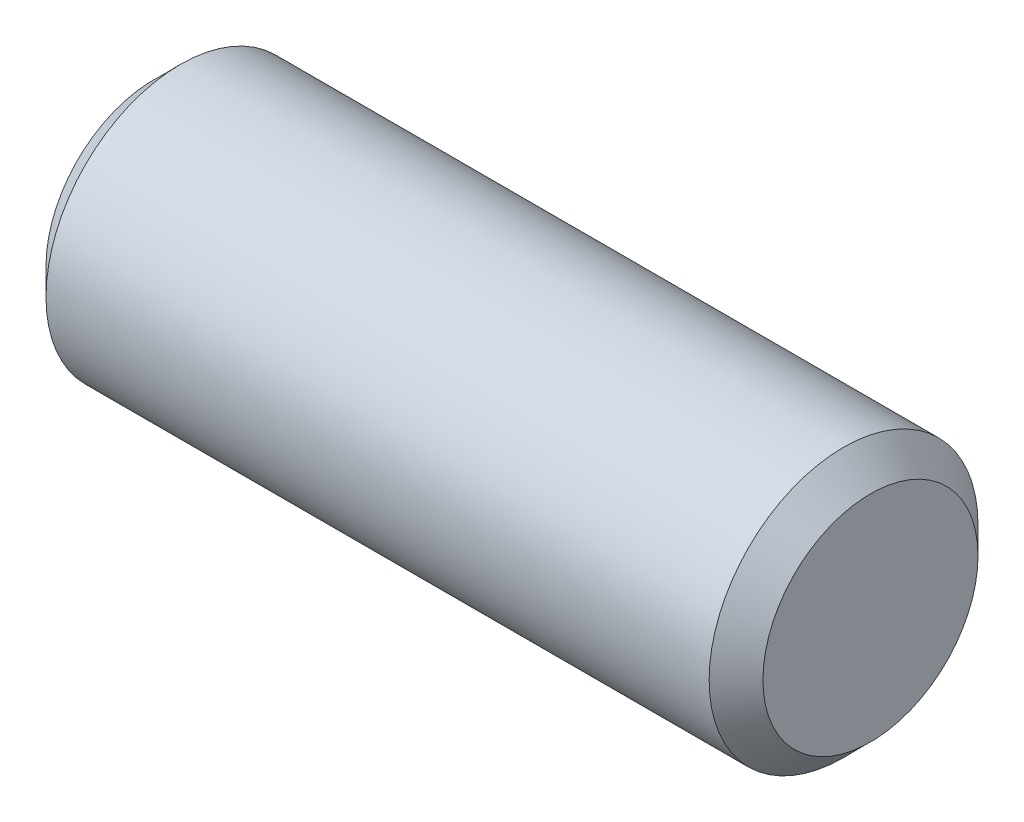
ISO-10303-21;
HEADER;
FILE_DESCRIPTION(('STEP AP214'),'2;1');
FILE_NAME('part.step','',(''),(''),'','','');
FILE_SCHEMA(('AUTOMOTIVE_DESIGN { 1 0 10303 214 1 1 1 1 }'));
ENDSEC;
DATA;
#1=APPLICATION_CONTEXT('core data for automotive mechanical design processes');
#2=APPLICATION_PROTOCOL_DEFINITION('international standard','automotive_design',2000,#1);
#3=PRODUCT_CONTEXT('',#1,'mechanical');
#4=PRODUCT('Part','Part','',(#3));
#5=PRODUCT_RELATED_PRODUCT_CATEGORY('part','',(#4));
#6=PRODUCT_DEFINITION_FORMATION('','',#4);
#7=PRODUCT_DEFINITION_CONTEXT('part definition',#1,'design');
#8=PRODUCT_DEFINITION('design','',#6,#7);
#9=PRODUCT_DEFINITION_SHAPE('','',#8);
#10=(LENGTH_UNIT() NAMED_UNIT(*) SI_UNIT(.MILLI.,.METRE.));
#11=(NAMED_UNIT(*) PLANE_ANGLE_UNIT() SI_UNIT($,.RADIAN.));
#12=(NAMED_UNIT(*) SI_UNIT($,.STERADIAN.) SOLID_ANGLE_UNIT());
#13=UNCERTAINTY_MEASURE_WITH_UNIT(LENGTH_MEASURE(1.E-05),#10,'distance_accuracy_value','');
#14=(GEOMETRIC_REPRESENTATION_CONTEXT(3) GLOBAL_UNCERTAINTY_ASSIGNED_CONTEXT((#13)) GLOBAL_UNIT_ASSIGNED_CONTEXT((#10,
#11,#12)) REPRESENTATION_CONTEXT('',''));
#15=CARTESIAN_POINT('',(0.,0.,0.));
#16=DIRECTION('',(0.,0.,1.));
#17=DIRECTION('',(1.,0.,0.));
#18=AXIS2_PLACEMENT_3D('',#15,#16,#17);
#19=CARTESIAN_POINT('',(-25.4,0.,0.));
#20=DIRECTION('',(1.,0.,0.));
#21=DIRECTION('',(0.,0.,-1.));
#22=AXIS2_PLACEMENT_3D('',#19,#20,#21);
#23=CYLINDRICAL_SURFACE('',#22,9.525);
#24=CARTESIAN_POINT('',(23.495,0.,0.));
#25=DIRECTION('',(1.,0.,0.));
#26=DIRECTION('',(0.,0.,-1.));
#27=AXIS2_PLACEMENT_3D('',#24,#25,#26);
#28=CIRCLE('',#27,9.525);
#29=CARTESIAN_POINT('',(23.495,0.,9.525));
#30=VERTEX_POINT('',#29);
#31=EDGE_CURVE('E37',#30,#30,#28,.F.);
#32=ORIENTED_EDGE('',*,*,#31,.T.);
#33=EDGE_LOOP('',(#32));
#34=FACE_BOUND('',#33,.T.);
#35=CARTESIAN_POINT('',(-23.495,0.,0.));
#36=DIRECTION('',(1.,0.,0.));
#37=DIRECTION('',(0.,0.,-1.));
#38=AXIS2_PLACEMENT_3D('',#35,#36,#37);
#39=CIRCLE('',#38,9.525);
#40=CARTESIAN_POINT('',(-23.495,0.,-9.525));
#41=VERTEX_POINT('',#40);
#42=EDGE_CURVE('E41',#41,#41,#39,.T.);
#43=ORIENTED_EDGE('',*,*,#42,.T.);
#44=EDGE_LOOP('',(#43));
#45=FACE_BOUND('',#44,.T.);
#46=ADVANCED_FACE('F30',(#34,#45),#23,.T.);
#47=CARTESIAN_POINT('',(-25.4,0.,0.));
#48=DIRECTION('',(1.,0.,0.));
#49=DIRECTION('',(0.,0.,-1.));
#50=AXIS2_PLACEMENT_3D('',#47,#48,#49);
#51=PLANE('',#50);
#52=CARTESIAN_POINT('',(-25.4,0.,0.));
#53=DIRECTION('',(1.,0.,0.));
#54=DIRECTION('',(0.,0.,-1.));
#55=AXIS2_PLACEMENT_3D('',#52,#53,#54);
#56=CIRCLE('',#55,7.61999999999999);
#57=CARTESIAN_POINT('',(-25.4,0.,-7.61999999999999));
#58=VERTEX_POINT('',#57);
#59=EDGE_CURVE('E10',#58,#58,#56,.F.);
#60=ORIENTED_EDGE('',*,*,#59,.T.);
#61=EDGE_LOOP('',(#60));
#62=FACE_BOUND('',#61,.T.);
#63=ADVANCED_FACE('F61',(#62),#51,.F.);
#64=CARTESIAN_POINT('',(25.4,0.,0.));
#65=DIRECTION('',(1.,0.,0.));
#66=DIRECTION('',(0.,0.,-1.));
#67=AXIS2_PLACEMENT_3D('',#64,#65,#66);
#68=PLANE('',#67);
#69=CARTESIAN_POINT('',(25.4,0.,0.));
#70=DIRECTION('',(1.,0.,0.));
#71=DIRECTION('',(0.,0.,-1.));
#72=AXIS2_PLACEMENT_3D('',#69,#70,#71);
#73=CIRCLE('',#72,7.61999999999999);
#74=CARTESIAN_POINT('',(25.4,0.,7.62));
#75=VERTEX_POINT('',#74);
#76=EDGE_CURVE('E45',#75,#75,#73,.T.);
#77=ORIENTED_EDGE('',*,*,#76,.T.);
#78=EDGE_LOOP('',(#77));
#79=FACE_BOUND('',#78,.T.);
#80=ADVANCED_FACE('F51',(#79),#68,.T.);
#81=CARTESIAN_POINT('',(25.4,0.,0.));
#82=DIRECTION('',(-1.,0.,0.));
#83=DIRECTION('',(0.,0.,1.));
#84=AXIS2_PLACEMENT_3D('',#81,#82,#83);
#85=CONICAL_SURFACE('',#84,7.61999999999999,0.785398163397449);
#86=CARTESIAN_POINT('',(23.495,0.,9.525));
#87=CARTESIAN_POINT('',(23.51484375,0.,9.50515625));
#88=CARTESIAN_POINT('',(23.5346875,0.,9.4853125));
#89=CARTESIAN_POINT('',(23.574375,0.,9.445625));
#90=CARTESIAN_POINT('',(23.59421875,0.,9.42578125));
#91=CARTESIAN_POINT('',(23.63390625,0.,9.38609375));
#92=CARTESIAN_POINT('',(23.65375,0.,9.36625));
#93=CARTESIAN_POINT('',(23.6934375,0.,9.3265625));
#94=CARTESIAN_POINT('',(23.71328125,0.,9.30671875));
#95=CARTESIAN_POINT('',(23.75296875,0.,9.26703125));
#96=CARTESIAN_POINT('',(23.7728125,0.,9.2471875));
#97=CARTESIAN_POINT('',(23.8125,0.,9.2075));
#98=CARTESIAN_POINT('',(23.83234375,0.,9.18765625));
#99=CARTESIAN_POINT('',(23.87203125,0.,9.14796875));
#100=CARTESIAN_POINT('',(23.891875,0.,9.128125));
#101=CARTESIAN_POINT('',(23.9315625,0.,9.0884375));
#102=CARTESIAN_POINT('',(23.95140625,0.,9.06859375));
#103=CARTESIAN_POINT('',(23.99109375,0.,9.02890625));
#104=CARTESIAN_POINT('',(24.0109375,0.,9.0090625));
#105=CARTESIAN_POINT('',(24.050625,0.,8.969375));
#106=CARTESIAN_POINT('',(24.07046875,0.,8.94953125));
#107=CARTESIAN_POINT('',(24.11015625,0.,8.90984375));
#108=CARTESIAN_POINT('',(24.13,0.,8.89));
#109=CARTESIAN_POINT('',(24.1696875,0.,8.8503125));
#110=CARTESIAN_POINT('',(24.18953125,0.,8.83046875));
#111=CARTESIAN_POINT('',(24.22921875,0.,8.79078125));
#112=CARTESIAN_POINT('',(24.2490625,0.,8.7709375));
#113=CARTESIAN_POINT('',(24.28875,0.,8.73125));
#114=CARTESIAN_POINT('',(24.30859375,0.,8.71140625));
#115=CARTESIAN_POINT('',(24.34828125,0.,8.67171875));
#116=CARTESIAN_POINT('',(24.368125,0.,8.651875));
#117=CARTESIAN_POINT('',(24.4078125,0.,8.6121875));
#118=CARTESIAN_POINT('',(24.42765625,0.,8.59234375));
#119=CARTESIAN_POINT('',(24.46734375,0.,8.55265625));
#120=CARTESIAN_POINT('',(24.4871875,0.,8.5328125));
#121=CARTESIAN_POINT('',(24.526875,0.,8.493125));
#122=CARTESIAN_POINT('',(24.54671875,0.,8.47328125));
#123=CARTESIAN_POINT('',(24.58640625,0.,8.43359375));
#124=CARTESIAN_POINT('',(24.60625,0.,8.41375));
#125=CARTESIAN_POINT('',(24.6459375,0.,8.3740625));
#126=CARTESIAN_POINT('',(24.66578125,0.,8.35421875));
#127=CARTESIAN_POINT('',(24.70546875,0.,8.31453125));
#128=CARTESIAN_POINT('',(24.7253125,0.,8.2946875));
#129=CARTESIAN_POINT('',(24.765,0.,8.255));
#130=CARTESIAN_POINT('',(24.78484375,0.,8.23515625));
#131=CARTESIAN_POINT('',(24.82453125,0.,8.19546875));
#132=CARTESIAN_POINT('',(24.844375,0.,8.175625));
#133=CARTESIAN_POINT('',(24.8840625,0.,8.1359375));
#134=CARTESIAN_POINT('',(24.90390625,0.,8.11609375));
#135=CARTESIAN_POINT('',(24.94359375,0.,8.07640625));
#136=CARTESIAN_POINT('',(24.9634375,0.,8.0565625));
#137=CARTESIAN_POINT('',(25.003125,0.,8.016875));
#138=CARTESIAN_POINT('',(25.02296875,0.,7.99703125));
#139=CARTESIAN_POINT('',(25.06265625,0.,7.95734375));
#140=CARTESIAN_POINT('',(25.0825,0.,7.9375));
#141=CARTESIAN_POINT('',(25.1221875,0.,7.8978125));
#142=CARTESIAN_POINT('',(25.14203125,0.,7.87796875));
#143=CARTESIAN_POINT('',(25.18171875,0.,7.83828125));
#144=CARTESIAN_POINT('',(25.2015625,0.,7.8184375));
#145=CARTESIAN_POINT('',(25.24125,0.,7.77875));
#146=CARTESIAN_POINT('',(25.26109375,0.,7.75890625));
#147=CARTESIAN_POINT('',(25.30078125,0.,7.71921875));
#148=CARTESIAN_POINT('',(25.320625,0.,7.699375));
#149=CARTESIAN_POINT('',(25.3603125,0.,7.6596875));
#150=CARTESIAN_POINT('',(25.38015625,0.,7.63984375));
#151=CARTESIAN_POINT('',(25.4,0.,7.62));
#152=B_SPLINE_CURVE_WITH_KNOTS('',3,(#86,#87,#88,#89,#90,#91,#92,#93,#94,#95,#96,#97,#98,#99,
#100,#101,#102,#103,#104,#105,#106,#107,#108,#109,#110,#111,#112,#113,#114,#115,#116,#117,#118,
#119,#120,#121,#122,#123,#124,#125,#126,#127,#128,#129,#130,#131,#132,#133,#134,#135,#136,#137,
#138,#139,#140,#141,#142,#143,#144,#145,#146,#147,#148,#149,#150,#151),.UNSPECIFIED.,.F.,.F.,(4,
2,2,2,2,2,2,2,2,2,2,2,2,2,2,2,2,2,2,2,2,2,2,2,2,2,2,2,2,2,2,2,4),(0.,0.0841899011350241,
0.168379802270048,0.252569703405071,0.336759604540095,0.420949505675119,0.505139406810142,
0.589329307945166,0.673519209080188,0.757709110215212,0.841899011350237,0.926088912485259,
1.01027881362028,1.09446871475531,1.17865861589033,1.26284851702535,1.34703841816038,
1.4312283192954,1.51541822043043,1.59960812156545,1.68379802270047,1.7679879238355,
1.85217782497052,1.93636772610554,2.02055762724057,2.10474752837559,2.18893742951061,
2.27312733064564,2.35731723178066,2.44150713291568,2.52569703405071,2.60988693518573,
2.69407683632075),.UNSPECIFIED.);
#153=EDGE_CURVE('BSEAM53',#30,#75,#152,.T.);
#154=ORIENTED_EDGE('',*,*,#31,.F.);
#155=ORIENTED_EDGE('',*,*,#76,.F.);
#156=ORIENTED_EDGE('',*,*,#153,.T.);
#157=ORIENTED_EDGE('',*,*,#153,.F.);
#158=EDGE_LOOP('',(#154,#156,#155,#157));
#159=FACE_BOUND('',#158,.T.);
#160=ADVANCED_FACE('F53',(#159),#85,.T.);
#161=CARTESIAN_POINT('',(-23.495,0.,0.));
#162=DIRECTION('',(1.,0.,0.));
#163=DIRECTION('',(0.,0.,-1.));
#164=AXIS2_PLACEMENT_3D('',#161,#162,#163);
#165=CONICAL_SURFACE('',#164,9.525,0.785398163397451);
#166=ORIENTED_EDGE('',*,*,#59,.F.);
#167=EDGE_LOOP('',(#166));
#168=FACE_BOUND('',#167,.T.);
#169=ORIENTED_EDGE('',*,*,#42,.F.);
#170=EDGE_LOOP('',(#169));
#171=FACE_BOUND('',#170,.T.);
#172=ADVANCED_FACE('F32',(#168,#171),#165,.T.);
#173=CLOSED_SHELL('',(#46,#63,#80,#160,#172));
#174=MANIFOLD_SOLID_BREP('B2',#173);
#175=ADVANCED_BREP_SHAPE_REPRESENTATION('',(#18,#174),#14);
#176=SHAPE_DEFINITION_REPRESENTATION(#9,#175);
ENDSEC;
END-ISO-10303-21;
